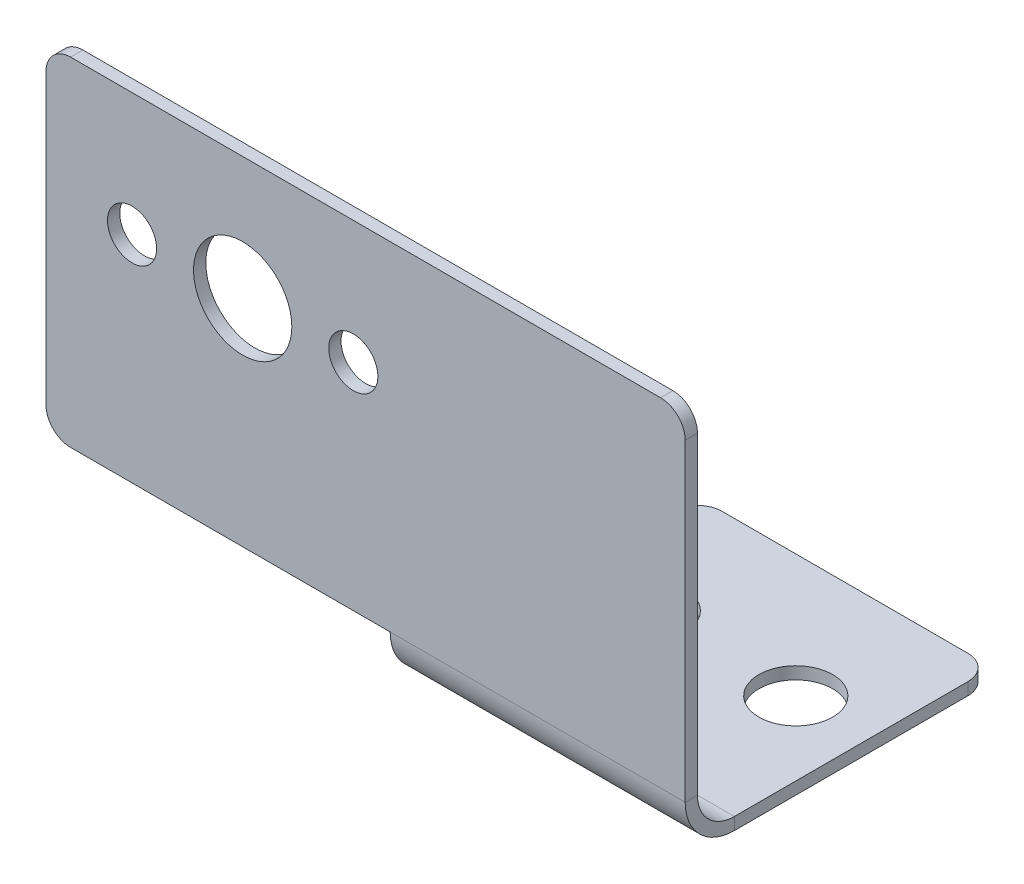
ISO-10303-21;
HEADER;
FILE_DESCRIPTION(('STEP AP214'),'2;1');
FILE_NAME('part.step','',(''),(''),'','','');
FILE_SCHEMA(('AUTOMOTIVE_DESIGN { 1 0 10303 214 1 1 1 1 }'));
ENDSEC;
DATA;
#1=APPLICATION_CONTEXT('core data for automotive mechanical design processes');
#2=APPLICATION_PROTOCOL_DEFINITION('international standard','automotive_design',2000,#1);
#3=PRODUCT_CONTEXT('',#1,'mechanical');
#4=PRODUCT('Part','Part','',(#3));
#5=PRODUCT_RELATED_PRODUCT_CATEGORY('part','',(#4));
#6=PRODUCT_DEFINITION_FORMATION('','',#4);
#7=PRODUCT_DEFINITION_CONTEXT('part definition',#1,'design');
#8=PRODUCT_DEFINITION('design','',#6,#7);
#9=PRODUCT_DEFINITION_SHAPE('','',#8);
#10=(LENGTH_UNIT() NAMED_UNIT(*) SI_UNIT(.MILLI.,.METRE.));
#11=(NAMED_UNIT(*) PLANE_ANGLE_UNIT() SI_UNIT($,.RADIAN.));
#12=(NAMED_UNIT(*) SI_UNIT($,.STERADIAN.) SOLID_ANGLE_UNIT());
#13=UNCERTAINTY_MEASURE_WITH_UNIT(LENGTH_MEASURE(1.E-05),#10,'distance_accuracy_value','');
#14=(GEOMETRIC_REPRESENTATION_CONTEXT(3) GLOBAL_UNCERTAINTY_ASSIGNED_CONTEXT((#13)) GLOBAL_UNIT_ASSIGNED_CONTEXT((#10,
#11,#12)) REPRESENTATION_CONTEXT('',''));
#15=CARTESIAN_POINT('',(0.,0.,0.));
#16=DIRECTION('',(0.,0.,1.));
#17=DIRECTION('',(1.,0.,0.));
#18=AXIS2_PLACEMENT_3D('',#15,#16,#17);
#19=CARTESIAN_POINT('',(6.,-11.7488935718911,-0.999999999999944));
#20=DIRECTION('',(1.,0.,0.));
#21=DIRECTION('',(0.,-1.,0.));
#22=AXIS2_PLACEMENT_3D('',#19,#20,#21);
#23=PLANE('',#22);
#24=DIRECTION('',(0.,-1.,0.));
#25=VECTOR('',#24,1.);
#26=CARTESIAN_POINT('',(6.,-11.7488935718911,-1.49999999999994));
#27=LINE('',#26,#25);
#28=CARTESIAN_POINT('',(6.,14.2511064281089,-1.50000000000004));
#29=VERTEX_POINT('',#28);
#30=CARTESIAN_POINT('',(6.,1.50000000000001,-1.49999999999999));
#31=VERTEX_POINT('',#30);
#32=EDGE_CURVE('E206',#29,#31,#27,.T.);
#33=ORIENTED_EDGE('',*,*,#32,.F.);
#34=DIRECTION('',(0.,0.,-1.));
#35=VECTOR('',#34,1.);
#36=CARTESIAN_POINT('',(6.,14.2511064281089,-1.00000000000004));
#37=LINE('',#36,#35);
#38=CARTESIAN_POINT('',(6.,14.2511064281089,-1.00000000000004));
#39=VERTEX_POINT('',#38);
#40=EDGE_CURVE('E12',#29,#39,#37,.F.);
#41=ORIENTED_EDGE('',*,*,#40,.T.);
#42=DIRECTION('',(0.,-1.,0.));
#43=VECTOR('',#42,1.);
#44=CARTESIAN_POINT('',(6.,-11.7488935718911,-0.999999999999944));
#45=LINE('',#44,#43);
#46=CARTESIAN_POINT('',(6.,1.50000000000001,-0.999999999999991));
#47=VERTEX_POINT('',#46);
#48=EDGE_CURVE('E231',#39,#47,#45,.T.);
#49=ORIENTED_EDGE('',*,*,#48,.T.);
#50=DIRECTION('',(0.,0.,-1.));
#51=VECTOR('',#50,1.);
#52=CARTESIAN_POINT('',(6.,1.50000000000001,-0.999999999999992));
#53=LINE('',#52,#51);
#54=EDGE_CURVE('E236',#47,#31,#53,.T.);
#55=ORIENTED_EDGE('',*,*,#54,.T.);
#56=EDGE_LOOP('',(#33,#41,#49,#55));
#57=FACE_BOUND('',#56,.T.);
#58=ADVANCED_FACE('F43',(#57),#23,.T.);
#59=CARTESIAN_POINT('',(0.,1.75110642810892,-1.49999999999999));
#60=DIRECTION('',(0.,0.,-1.));
#61=DIRECTION('',(0.,1.,0.));
#62=AXIS2_PLACEMENT_3D('',#59,#60,#61);
#63=PLANE('',#62);
#64=CARTESIAN_POINT('',(-16.5,10.2511064281089,-1.50000000000002));
#65=DIRECTION('',(0.,0.,-1.));
#66=DIRECTION('',(0.,1.,0.));
#67=AXIS2_PLACEMENT_3D('',#64,#65,#66);
#68=CIRCLE('',#67,1.);
#69=CARTESIAN_POINT('',(-16.5,11.2511064281089,-1.50000000000002));
#70=VERTEX_POINT('',#69);
#71=EDGE_CURVE('E195',#70,#70,#68,.T.);
#72=ORIENTED_EDGE('',*,*,#71,.F.);
#73=EDGE_LOOP('',(#72));
#74=FACE_BOUND('',#73,.T.);
#75=CARTESIAN_POINT('',(-7.5,10.2511064281089,-1.50000000000002));
#76=DIRECTION('',(0.,0.,-1.));
#77=DIRECTION('',(0.,1.,0.));
#78=AXIS2_PLACEMENT_3D('',#75,#76,#77);
#79=CIRCLE('',#78,1.);
#80=CARTESIAN_POINT('',(-7.5,11.2511064281089,-1.50000000000002));
#81=VERTEX_POINT('',#80);
#82=EDGE_CURVE('E412',#81,#81,#79,.T.);
#83=ORIENTED_EDGE('',*,*,#82,.F.);
#84=EDGE_LOOP('',(#83));
#85=FACE_BOUND('',#84,.T.);
#86=CARTESIAN_POINT('',(-12.,10.2511064281089,-1.50000000000002));
#87=DIRECTION('',(0.,0.,-1.));
#88=DIRECTION('',(0.,1.,0.));
#89=AXIS2_PLACEMENT_3D('',#86,#87,#88);
#90=CIRCLE('',#89,2.);
#91=CARTESIAN_POINT('',(-12.,12.2511064281089,-1.50000000000003));
#92=VERTEX_POINT('',#91);
#93=EDGE_CURVE('E405',#92,#92,#90,.T.);
#94=ORIENTED_EDGE('',*,*,#93,.F.);
#95=EDGE_LOOP('',(#94));
#96=FACE_BOUND('',#95,.T.);
#97=DIRECTION('',(-1.,0.,0.));
#98=VECTOR('',#97,1.);
#99=CARTESIAN_POINT('',(-20.,1.50000000000001,-1.49999999999999));
#100=LINE('',#99,#98);
#101=CARTESIAN_POINT('',(-6.,1.50000000000001,-1.49999999999999));
#102=VERTEX_POINT('',#101);
#103=CARTESIAN_POINT('',(-19.,1.50000000000001,-1.49999999999999));
#104=VERTEX_POINT('',#103);
#105=EDGE_CURVE('E179',#102,#104,#100,.T.);
#106=ORIENTED_EDGE('',*,*,#105,.T.);
#107=CARTESIAN_POINT('',(-19.,2.50000000000001,-1.49999999999999));
#108=DIRECTION('',(0.,0.,-1.));
#109=DIRECTION('',(0.,1.,0.));
#110=AXIS2_PLACEMENT_3D('',#107,#108,#109);
#111=CIRCLE('',#110,1.);
#112=CARTESIAN_POINT('',(-20.,2.50000000000001,-1.49999999999999));
#113=VERTEX_POINT('',#112);
#114=EDGE_CURVE('E247',#104,#113,#111,.T.);
#115=ORIENTED_EDGE('',*,*,#114,.T.);
#116=DIRECTION('',(0.,1.,0.));
#117=VECTOR('',#116,1.);
#118=CARTESIAN_POINT('',(-20.,15.2511064281089,-1.50000000000004));
#119=LINE('',#118,#117);
#120=CARTESIAN_POINT('',(-20.,14.2511064281089,-1.50000000000004));
#121=VERTEX_POINT('',#120);
#122=EDGE_CURVE('E187',#113,#121,#119,.T.);
#123=ORIENTED_EDGE('',*,*,#122,.T.);
#124=CARTESIAN_POINT('',(-19.,14.2511064281089,-1.50000000000004));
#125=DIRECTION('',(0.,0.,-1.));
#126=DIRECTION('',(0.,1.,0.));
#127=AXIS2_PLACEMENT_3D('',#124,#125,#126);
#128=CIRCLE('',#127,1.);
#129=CARTESIAN_POINT('',(-19.,15.2511064281089,-1.50000000000004));
#130=VERTEX_POINT('',#129);
#131=EDGE_CURVE('E245',#121,#130,#128,.T.);
#132=ORIENTED_EDGE('',*,*,#131,.T.);
#133=DIRECTION('',(1.,0.,0.));
#134=VECTOR('',#133,1.);
#135=CARTESIAN_POINT('',(-6.,15.2511064281089,-1.50000000000004));
#136=LINE('',#135,#134);
#137=CARTESIAN_POINT('',(5.,15.2511064281089,-1.50000000000004));
#138=VERTEX_POINT('',#137);
#139=EDGE_CURVE('E232',#130,#138,#136,.T.);
#140=ORIENTED_EDGE('',*,*,#139,.T.);
#141=CARTESIAN_POINT('',(5.,14.2511064281089,-1.50000000000004));
#142=DIRECTION('',(0.,0.,-1.));
#143=DIRECTION('',(0.,1.,0.));
#144=AXIS2_PLACEMENT_3D('',#141,#142,#143);
#145=CIRCLE('',#144,1.);
#146=EDGE_CURVE('E243',#138,#29,#145,.T.);
#147=ORIENTED_EDGE('',*,*,#146,.T.);
#148=ORIENTED_EDGE('',*,*,#32,.T.);
#149=DIRECTION('',(-1.,0.,0.));
#150=VECTOR('',#149,1.);
#151=CARTESIAN_POINT('',(0.,1.50000000000001,-1.49999999999999));
#152=LINE('',#151,#150);
#153=EDGE_CURVE('E180',#31,#102,#152,.T.);
#154=ORIENTED_EDGE('',*,*,#153,.T.);
#155=EDGE_LOOP('',(#106,#115,#123,#132,#140,#147,#148,#154));
#156=FACE_BOUND('',#155,.T.);
#157=ADVANCED_FACE('F293',(#74,#85,#96,#156),#63,.T.);
#158=CARTESIAN_POINT('',(-6.,15.2511064281089,-1.00000000000004));
#159=DIRECTION('',(0.,1.,0.));
#160=DIRECTION('',(1.,0.,0.));
#161=AXIS2_PLACEMENT_3D('',#158,#159,#160);
#162=PLANE('',#161);
#163=ORIENTED_EDGE('',*,*,#139,.F.);
#164=DIRECTION('',(0.,0.,-1.));
#165=VECTOR('',#164,1.);
#166=CARTESIAN_POINT('',(-19.,15.2511064281089,-1.00000000000004));
#167=LINE('',#166,#165);
#168=CARTESIAN_POINT('',(-19.,15.2511064281089,-1.00000000000004));
#169=VERTEX_POINT('',#168);
#170=EDGE_CURVE('E262',#130,#169,#167,.F.);
#171=ORIENTED_EDGE('',*,*,#170,.T.);
#172=DIRECTION('',(1.,0.,0.));
#173=VECTOR('',#172,1.);
#174=CARTESIAN_POINT('',(-6.,15.2511064281089,-1.00000000000004));
#175=LINE('',#174,#173);
#176=CARTESIAN_POINT('',(5.,15.2511064281089,-1.00000000000004));
#177=VERTEX_POINT('',#176);
#178=EDGE_CURVE('E169',#169,#177,#175,.T.);
#179=ORIENTED_EDGE('',*,*,#178,.T.);
#180=DIRECTION('',(0.,0.,-1.));
#181=VECTOR('',#180,1.);
#182=CARTESIAN_POINT('',(5.,15.2511064281089,-1.00000000000004));
#183=LINE('',#182,#181);
#184=EDGE_CURVE('E259',#177,#138,#183,.T.);
#185=ORIENTED_EDGE('',*,*,#184,.T.);
#186=EDGE_LOOP('',(#163,#171,#179,#185));
#187=FACE_BOUND('',#186,.T.);
#188=ADVANCED_FACE('F303',(#187),#162,.T.);
#189=CARTESIAN_POINT('',(0.,1.75110642810892,-0.999999999999992));
#190=DIRECTION('',(0.,0.,-1.));
#191=DIRECTION('',(0.,1.,0.));
#192=AXIS2_PLACEMENT_3D('',#189,#190,#191);
#193=PLANE('',#192);
#194=CARTESIAN_POINT('',(-16.5,10.2511064281089,-0.999999999999986));
#195=DIRECTION('',(0.,0.,1.));
#196=DIRECTION('',(1.,0.,0.));
#197=AXIS2_PLACEMENT_3D('',#194,#195,#196);
#198=CIRCLE('',#197,1.);
#199=CARTESIAN_POINT('',(-15.5,10.2511064281089,-0.999999999999986));
#200=VERTEX_POINT('',#199);
#201=EDGE_CURVE('E402',#200,#200,#198,.T.);
#202=ORIENTED_EDGE('',*,*,#201,.F.);
#203=EDGE_LOOP('',(#202));
#204=FACE_BOUND('',#203,.T.);
#205=CARTESIAN_POINT('',(-7.5,10.2511064281089,-0.999999999999986));
#206=DIRECTION('',(0.,0.,1.));
#207=DIRECTION('',(1.,0.,0.));
#208=AXIS2_PLACEMENT_3D('',#205,#206,#207);
#209=CIRCLE('',#208,1.);
#210=CARTESIAN_POINT('',(-6.5,10.2511064281089,-0.999999999999986));
#211=VERTEX_POINT('',#210);
#212=EDGE_CURVE('E406',#211,#211,#209,.T.);
#213=ORIENTED_EDGE('',*,*,#212,.F.);
#214=EDGE_LOOP('',(#213));
#215=FACE_BOUND('',#214,.T.);
#216=CARTESIAN_POINT('',(-12.,10.2511064281089,-0.999999999999986));
#217=DIRECTION('',(0.,0.,1.));
#218=DIRECTION('',(1.,0.,0.));
#219=AXIS2_PLACEMENT_3D('',#216,#217,#218);
#220=CIRCLE('',#219,2.);
#221=CARTESIAN_POINT('',(-10.,10.2511064281089,-0.999999999999986));
#222=VERTEX_POINT('',#221);
#223=EDGE_CURVE('E396',#222,#222,#220,.T.);
#224=ORIENTED_EDGE('',*,*,#223,.F.);
#225=EDGE_LOOP('',(#224));
#226=FACE_BOUND('',#225,.T.);
#227=DIRECTION('',(0.,1.,0.));
#228=VECTOR('',#227,1.);
#229=CARTESIAN_POINT('',(-20.,15.2511064281089,-1.00000000000004));
#230=LINE('',#229,#228);
#231=CARTESIAN_POINT('',(-20.,2.50000000000001,-0.999999999999994));
#232=VERTEX_POINT('',#231);
#233=CARTESIAN_POINT('',(-20.,14.2511064281089,-1.00000000000004));
#234=VERTEX_POINT('',#233);
#235=EDGE_CURVE('E186',#232,#234,#230,.T.);
#236=ORIENTED_EDGE('',*,*,#235,.F.);
#237=CARTESIAN_POINT('',(-19.,2.50000000000001,-0.999999999999994));
#238=DIRECTION('',(0.,0.,-1.));
#239=DIRECTION('',(0.,1.,0.));
#240=AXIS2_PLACEMENT_3D('',#237,#238,#239);
#241=CIRCLE('',#240,1.);
#242=CARTESIAN_POINT('',(-19.,1.50000000000001,-0.999999999999991));
#243=VERTEX_POINT('',#242);
#244=EDGE_CURVE('E185',#232,#243,#241,.F.);
#245=ORIENTED_EDGE('',*,*,#244,.T.);
#246=DIRECTION('',(-1.,0.,0.));
#247=VECTOR('',#246,1.);
#248=CARTESIAN_POINT('',(-20.,1.50000000000001,-0.999999999999991));
#249=LINE('',#248,#247);
#250=CARTESIAN_POINT('',(-6.,1.50000000000001,-0.999999999999991));
#251=VERTEX_POINT('',#250);
#252=EDGE_CURVE('E176',#251,#243,#249,.T.);
#253=ORIENTED_EDGE('',*,*,#252,.F.);
#254=DIRECTION('',(-1.,0.,0.));
#255=VECTOR('',#254,1.);
#256=CARTESIAN_POINT('',(0.,1.50000000000001,-0.999999999999991));
#257=LINE('',#256,#255);
#258=EDGE_CURVE('E162',#47,#251,#257,.T.);
#259=ORIENTED_EDGE('',*,*,#258,.F.);
#260=ORIENTED_EDGE('',*,*,#48,.F.);
#261=CARTESIAN_POINT('',(5.,14.2511064281089,-1.00000000000004));
#262=DIRECTION('',(0.,0.,-1.));
#263=DIRECTION('',(0.,1.,0.));
#264=AXIS2_PLACEMENT_3D('',#261,#262,#263);
#265=CIRCLE('',#264,1.);
#266=EDGE_CURVE('E254',#39,#177,#265,.F.);
#267=ORIENTED_EDGE('',*,*,#266,.T.);
#268=ORIENTED_EDGE('',*,*,#178,.F.);
#269=CARTESIAN_POINT('',(-19.,14.2511064281089,-1.00000000000004));
#270=DIRECTION('',(0.,0.,-1.));
#271=DIRECTION('',(0.,1.,0.));
#272=AXIS2_PLACEMENT_3D('',#269,#270,#271);
#273=CIRCLE('',#272,1.);
#274=EDGE_CURVE('E256',#169,#234,#273,.F.);
#275=ORIENTED_EDGE('',*,*,#274,.T.);
#276=EDGE_LOOP('',(#236,#245,#253,#259,#260,#267,#268,#275));
#277=FACE_BOUND('',#276,.T.);
#278=ADVANCED_FACE('F183',(#204,#215,#226,#277),#193,.F.);
#279=CARTESIAN_POINT('',(-6.,-0.5,-13.5));
#280=DIRECTION('',(0.,0.,-1.));
#281=DIRECTION('',(-1.,0.,0.));
#282=AXIS2_PLACEMENT_3D('',#279,#280,#281);
#283=PLANE('',#282);
#284=DIRECTION('',(-1.,0.,0.));
#285=VECTOR('',#284,1.);
#286=CARTESIAN_POINT('',(-6.,-0.5,-13.5));
#287=LINE('',#286,#285);
#288=CARTESIAN_POINT('',(5.,-0.5,-13.5));
#289=VERTEX_POINT('',#288);
#290=CARTESIAN_POINT('',(-5.,-0.5,-13.5));
#291=VERTEX_POINT('',#290);
#292=EDGE_CURVE('E220',#289,#291,#287,.T.);
#293=ORIENTED_EDGE('',*,*,#292,.T.);
#294=DIRECTION('',(0.,1.,0.));
#295=VECTOR('',#294,1.);
#296=CARTESIAN_POINT('',(-5.,-0.5,-13.5));
#297=LINE('',#296,#295);
#298=CARTESIAN_POINT('',(-5.,0.,-13.5));
#299=VERTEX_POINT('',#298);
#300=EDGE_CURVE('E266',#291,#299,#297,.T.);
#301=ORIENTED_EDGE('',*,*,#300,.T.);
#302=DIRECTION('',(-1.,0.,0.));
#303=VECTOR('',#302,1.);
#304=CARTESIAN_POINT('',(-6.,0.,-13.5));
#305=LINE('',#304,#303);
#306=CARTESIAN_POINT('',(5.,0.,-13.5));
#307=VERTEX_POINT('',#306);
#308=EDGE_CURVE('E209',#307,#299,#305,.T.);
#309=ORIENTED_EDGE('',*,*,#308,.F.);
#310=DIRECTION('',(0.,1.,0.));
#311=VECTOR('',#310,1.);
#312=CARTESIAN_POINT('',(5.,-0.5,-13.5));
#313=LINE('',#312,#311);
#314=EDGE_CURVE('E264',#307,#289,#313,.F.);
#315=ORIENTED_EDGE('',*,*,#314,.T.);
#316=EDGE_LOOP('',(#293,#301,#309,#315));
#317=FACE_BOUND('',#316,.T.);
#318=ADVANCED_FACE('F337',(#317),#283,.T.);
#319=CARTESIAN_POINT('',(0.,-0.5,0.));
#320=DIRECTION('',(0.,1.,0.));
#321=DIRECTION('',(0.,0.,1.));
#322=AXIS2_PLACEMENT_3D('',#319,#320,#321);
#323=PLANE('',#322);
#324=CARTESIAN_POINT('',(-3.,-0.5,-8.5));
#325=DIRECTION('',(0.,1.,0.));
#326=DIRECTION('',(0.,0.,1.));
#327=AXIS2_PLACEMENT_3D('',#324,#325,#326);
#328=CIRCLE('',#327,1.5);
#329=CARTESIAN_POINT('',(-3.,-0.5,-7.));
#330=VERTEX_POINT('',#329);
#331=EDGE_CURVE('E392',#330,#330,#328,.T.);
#332=ORIENTED_EDGE('',*,*,#331,.T.);
#333=EDGE_LOOP('',(#332));
#334=FACE_BOUND('',#333,.T.);
#335=CARTESIAN_POINT('',(3.,-0.5,-8.5));
#336=DIRECTION('',(0.,1.,0.));
#337=DIRECTION('',(0.,0.,1.));
#338=AXIS2_PLACEMENT_3D('',#335,#336,#337);
#339=CIRCLE('',#338,1.5);
#340=CARTESIAN_POINT('',(3.,-0.5,-7.));
#341=VERTEX_POINT('',#340);
#342=EDGE_CURVE('E390',#341,#341,#339,.T.);
#343=ORIENTED_EDGE('',*,*,#342,.T.);
#344=EDGE_LOOP('',(#343));
#345=FACE_BOUND('',#344,.T.);
#346=DIRECTION('',(0.,0.,1.));
#347=VECTOR('',#346,1.);
#348=CARTESIAN_POINT('',(-6.,-0.5,-13.5));
#349=LINE('',#348,#347);
#350=CARTESIAN_POINT('',(-6.,-0.5,-12.5));
#351=VERTEX_POINT('',#350);
#352=CARTESIAN_POINT('',(-6.,-0.5,-2.99999999999999));
#353=VERTEX_POINT('',#352);
#354=EDGE_CURVE('E215',#351,#353,#349,.T.);
#355=ORIENTED_EDGE('',*,*,#354,.F.);
#356=CARTESIAN_POINT('',(-5.,-0.5,-12.5));
#357=DIRECTION('',(0.,1.,0.));
#358=DIRECTION('',(0.,0.,1.));
#359=AXIS2_PLACEMENT_3D('',#356,#357,#358);
#360=CIRCLE('',#359,1.);
#361=EDGE_CURVE('E275',#351,#291,#360,.F.);
#362=ORIENTED_EDGE('',*,*,#361,.T.);
#363=ORIENTED_EDGE('',*,*,#292,.F.);
#364=CARTESIAN_POINT('',(5.,-0.5,-12.5));
#365=DIRECTION('',(0.,1.,0.));
#366=DIRECTION('',(0.,0.,1.));
#367=AXIS2_PLACEMENT_3D('',#364,#365,#366);
#368=CIRCLE('',#367,1.);
#369=CARTESIAN_POINT('',(6.,-0.5,-12.5));
#370=VERTEX_POINT('',#369);
#371=EDGE_CURVE('E58',#289,#370,#368,.F.);
#372=ORIENTED_EDGE('',*,*,#371,.T.);
#373=DIRECTION('',(0.,0.,-1.));
#374=VECTOR('',#373,1.);
#375=CARTESIAN_POINT('',(6.,-0.5,-13.5));
#376=LINE('',#375,#374);
#377=CARTESIAN_POINT('',(6.,-0.5,-2.99999999999999));
#378=VERTEX_POINT('',#377);
#379=EDGE_CURVE('E204',#378,#370,#376,.T.);
#380=ORIENTED_EDGE('',*,*,#379,.F.);
#381=DIRECTION('',(-1.,0.,0.));
#382=VECTOR('',#381,1.);
#383=CARTESIAN_POINT('',(0.,-0.5,-2.99999999999999));
#384=LINE('',#383,#382);
#385=EDGE_CURVE('E217',#378,#353,#384,.T.);
#386=ORIENTED_EDGE('',*,*,#385,.T.);
#387=EDGE_LOOP('',(#355,#362,#363,#372,#380,#386));
#388=FACE_BOUND('',#387,.T.);
#389=ADVANCED_FACE('F349',(#334,#345,#388),#323,.F.);
#390=CARTESIAN_POINT('',(-6.,-0.5,-13.5));
#391=DIRECTION('',(-1.,0.,0.));
#392=DIRECTION('',(0.,0.,1.));
#393=AXIS2_PLACEMENT_3D('',#390,#391,#392);
#394=PLANE('',#393);
#395=DIRECTION('',(0.,0.,1.));
#396=VECTOR('',#395,1.);
#397=CARTESIAN_POINT('',(-6.,0.,-13.5));
#398=LINE('',#397,#396);
#399=CARTESIAN_POINT('',(-6.,0.,-12.5));
#400=VERTEX_POINT('',#399);
#401=CARTESIAN_POINT('',(-6.,0.,-2.99999999999999));
#402=VERTEX_POINT('',#401);
#403=EDGE_CURVE('E207',#400,#402,#398,.T.);
#404=ORIENTED_EDGE('',*,*,#403,.F.);
#405=DIRECTION('',(0.,1.,0.));
#406=VECTOR('',#405,1.);
#407=CARTESIAN_POINT('',(-6.,-0.5,-12.5));
#408=LINE('',#407,#406);
#409=EDGE_CURVE('E66',#400,#351,#408,.F.);
#410=ORIENTED_EDGE('',*,*,#409,.T.);
#411=ORIENTED_EDGE('',*,*,#354,.T.);
#412=DIRECTION('',(0.,-1.,0.));
#413=VECTOR('',#412,1.);
#414=CARTESIAN_POINT('',(-6.,-0.499999999999999,-2.99999999999999));
#415=LINE('',#414,#413);
#416=EDGE_CURVE('E154',#402,#353,#415,.T.);
#417=ORIENTED_EDGE('',*,*,#416,.F.);
#418=EDGE_LOOP('',(#404,#410,#411,#417));
#419=FACE_BOUND('',#418,.T.);
#420=ADVANCED_FACE('F345',(#419),#394,.T.);
#421=CARTESIAN_POINT('',(0.,0.,0.));
#422=DIRECTION('',(0.,1.,0.));
#423=DIRECTION('',(0.,0.,1.));
#424=AXIS2_PLACEMENT_3D('',#421,#422,#423);
#425=PLANE('',#424);
#426=CARTESIAN_POINT('',(-3.,0.,-8.5));
#427=DIRECTION('',(0.,1.,0.));
#428=DIRECTION('',(0.,0.,1.));
#429=AXIS2_PLACEMENT_3D('',#426,#427,#428);
#430=CIRCLE('',#429,1.5);
#431=CARTESIAN_POINT('',(-3.,0.,-7.));
#432=VERTEX_POINT('',#431);
#433=EDGE_CURVE('E393',#432,#432,#430,.T.);
#434=ORIENTED_EDGE('',*,*,#433,.F.);
#435=EDGE_LOOP('',(#434));
#436=FACE_BOUND('',#435,.T.);
#437=CARTESIAN_POINT('',(3.,0.,-8.5));
#438=DIRECTION('',(0.,1.,0.));
#439=DIRECTION('',(0.,0.,1.));
#440=AXIS2_PLACEMENT_3D('',#437,#438,#439);
#441=CIRCLE('',#440,1.5);
#442=CARTESIAN_POINT('',(3.,0.,-7.));
#443=VERTEX_POINT('',#442);
#444=EDGE_CURVE('E387',#443,#443,#441,.T.);
#445=ORIENTED_EDGE('',*,*,#444,.F.);
#446=EDGE_LOOP('',(#445));
#447=FACE_BOUND('',#446,.T.);
#448=ORIENTED_EDGE('',*,*,#308,.T.);
#449=CARTESIAN_POINT('',(-5.,0.,-12.5));
#450=DIRECTION('',(0.,1.,0.));
#451=DIRECTION('',(0.,0.,1.));
#452=AXIS2_PLACEMENT_3D('',#449,#450,#451);
#453=CIRCLE('',#452,1.);
#454=EDGE_CURVE('E271',#299,#400,#453,.T.);
#455=ORIENTED_EDGE('',*,*,#454,.T.);
#456=ORIENTED_EDGE('',*,*,#403,.T.);
#457=DIRECTION('',(-1.,0.,0.));
#458=VECTOR('',#457,1.);
#459=CARTESIAN_POINT('',(0.,0.,-2.99999999999999));
#460=LINE('',#459,#458);
#461=CARTESIAN_POINT('',(6.,0.,-2.99999999999999));
#462=VERTEX_POINT('',#461);
#463=EDGE_CURVE('E224',#462,#402,#460,.T.);
#464=ORIENTED_EDGE('',*,*,#463,.F.);
#465=DIRECTION('',(0.,0.,-1.));
#466=VECTOR('',#465,1.);
#467=CARTESIAN_POINT('',(6.,0.,-13.5));
#468=LINE('',#467,#466);
#469=CARTESIAN_POINT('',(6.,0.,-12.5));
#470=VERTEX_POINT('',#469);
#471=EDGE_CURVE('E212',#462,#470,#468,.T.);
#472=ORIENTED_EDGE('',*,*,#471,.T.);
#473=CARTESIAN_POINT('',(5.,0.,-12.5));
#474=DIRECTION('',(0.,1.,0.));
#475=DIRECTION('',(0.,0.,1.));
#476=AXIS2_PLACEMENT_3D('',#473,#474,#475);
#477=CIRCLE('',#476,1.);
#478=EDGE_CURVE('E269',#470,#307,#477,.T.);
#479=ORIENTED_EDGE('',*,*,#478,.T.);
#480=EDGE_LOOP('',(#448,#455,#456,#464,#472,#479));
#481=FACE_BOUND('',#480,.T.);
#482=ADVANCED_FACE('F284',(#436,#447,#481),#425,.T.);
#483=CARTESIAN_POINT('',(6.,-0.5,-13.5));
#484=DIRECTION('',(1.,0.,0.));
#485=DIRECTION('',(0.,0.,-1.));
#486=AXIS2_PLACEMENT_3D('',#483,#484,#485);
#487=PLANE('',#486);
#488=ORIENTED_EDGE('',*,*,#379,.T.);
#489=DIRECTION('',(0.,1.,0.));
#490=VECTOR('',#489,1.);
#491=CARTESIAN_POINT('',(6.,-0.5,-12.5));
#492=LINE('',#491,#490);
#493=EDGE_CURVE('E51',#370,#470,#492,.T.);
#494=ORIENTED_EDGE('',*,*,#493,.T.);
#495=ORIENTED_EDGE('',*,*,#471,.F.);
#496=DIRECTION('',(0.,1.,0.));
#497=VECTOR('',#496,1.);
#498=CARTESIAN_POINT('',(6.,-0.499999999999999,-2.99999999999999));
#499=LINE('',#498,#497);
#500=EDGE_CURVE('E157',#378,#462,#499,.T.);
#501=ORIENTED_EDGE('',*,*,#500,.F.);
#502=EDGE_LOOP('',(#488,#494,#495,#501));
#503=FACE_BOUND('',#502,.T.);
#504=ADVANCED_FACE('F279',(#503),#487,.T.);
#505=CARTESIAN_POINT('',(6.,1.5,-2.99999999999999));
#506=DIRECTION('',(1.,0.,0.));
#507=DIRECTION('',(0.,0.,-1.));
#508=AXIS2_PLACEMENT_3D('',#505,#506,#507);
#509=PLANE('',#508);
#510=ORIENTED_EDGE('',*,*,#500,.T.);
#511=CARTESIAN_POINT('',(6.,1.5,-2.99999999999999));
#512=DIRECTION('',(-1.,0.,0.));
#513=DIRECTION('',(0.,0.,1.));
#514=AXIS2_PLACEMENT_3D('',#511,#512,#513);
#515=CIRCLE('',#514,1.5);
#516=EDGE_CURVE('E190',#462,#31,#515,.T.);
#517=ORIENTED_EDGE('',*,*,#516,.T.);
#518=ORIENTED_EDGE('',*,*,#54,.F.);
#519=CARTESIAN_POINT('',(6.,1.5,-2.99999999999999));
#520=DIRECTION('',(-1.,0.,0.));
#521=DIRECTION('',(0.,0.,-1.));
#522=AXIS2_PLACEMENT_3D('',#519,#520,#521);
#523=CIRCLE('',#522,2.);
#524=EDGE_CURVE('E158',#378,#47,#523,.T.);
#525=ORIENTED_EDGE('',*,*,#524,.F.);
#526=EDGE_LOOP('',(#510,#517,#518,#525));
#527=FACE_BOUND('',#526,.T.);
#528=ADVANCED_FACE('F289',(#527),#509,.T.);
#529=CARTESIAN_POINT('',(-6.,1.5,-2.99999999999999));
#530=DIRECTION('',(-1.,0.,0.));
#531=DIRECTION('',(0.,0.,1.));
#532=AXIS2_PLACEMENT_3D('',#529,#530,#531);
#533=PLANE('',#532);
#534=DIRECTION('',(0.,0.,1.));
#535=VECTOR('',#534,1.);
#536=CARTESIAN_POINT('',(-6.,1.50000000000001,-0.999999999999992));
#537=LINE('',#536,#535);
#538=EDGE_CURVE('E151',#102,#251,#537,.T.);
#539=ORIENTED_EDGE('',*,*,#538,.F.);
#540=CARTESIAN_POINT('',(-6.,1.5,-2.99999999999999));
#541=DIRECTION('',(-1.,0.,0.));
#542=DIRECTION('',(0.,0.,1.));
#543=AXIS2_PLACEMENT_3D('',#540,#541,#542);
#544=CIRCLE('',#543,1.5);
#545=EDGE_CURVE('E199',#102,#402,#544,.F.);
#546=ORIENTED_EDGE('',*,*,#545,.T.);
#547=ORIENTED_EDGE('',*,*,#416,.T.);
#548=CARTESIAN_POINT('',(-6.,1.5,-2.99999999999999));
#549=DIRECTION('',(1.,0.,0.));
#550=DIRECTION('',(0.,0.,1.));
#551=AXIS2_PLACEMENT_3D('',#548,#549,#550);
#552=CIRCLE('',#551,2.);
#553=EDGE_CURVE('E146',#251,#353,#552,.T.);
#554=ORIENTED_EDGE('',*,*,#553,.F.);
#555=EDGE_LOOP('',(#539,#546,#547,#554));
#556=FACE_BOUND('',#555,.T.);
#557=ADVANCED_FACE('F148',(#556),#533,.T.);
#558=CARTESIAN_POINT('',(12.3209746314804,1.5,-2.99999999999999));
#559=DIRECTION('',(-1.,0.,0.));
#560=DIRECTION('',(0.,0.,1.));
#561=AXIS2_PLACEMENT_3D('',#558,#559,#560);
#562=CYLINDRICAL_SURFACE('',#561,2.);
#563=ORIENTED_EDGE('',*,*,#553,.T.);
#564=ORIENTED_EDGE('',*,*,#385,.F.);
#565=ORIENTED_EDGE('',*,*,#524,.T.);
#566=ORIENTED_EDGE('',*,*,#258,.T.);
#567=EDGE_LOOP('',(#563,#564,#565,#566));
#568=FACE_BOUND('',#567,.T.);
#569=ADVANCED_FACE('F163',(#568),#562,.T.);
#570=CARTESIAN_POINT('',(12.3209746314804,1.5,-2.99999999999999));
#571=DIRECTION('',(-1.,0.,0.));
#572=DIRECTION('',(0.,0.,1.));
#573=AXIS2_PLACEMENT_3D('',#570,#571,#572);
#574=CYLINDRICAL_SURFACE('',#573,1.5);
#575=ORIENTED_EDGE('',*,*,#545,.F.);
#576=ORIENTED_EDGE('',*,*,#153,.F.);
#577=ORIENTED_EDGE('',*,*,#516,.F.);
#578=ORIENTED_EDGE('',*,*,#463,.T.);
#579=EDGE_LOOP('',(#575,#576,#577,#578));
#580=FACE_BOUND('',#579,.T.);
#581=ADVANCED_FACE('F291',(#580),#574,.F.);
#582=CARTESIAN_POINT('',(-20.,15.2511064281089,-1.00000000000004));
#583=DIRECTION('',(-1.,0.,0.));
#584=DIRECTION('',(0.,-1.,0.));
#585=AXIS2_PLACEMENT_3D('',#582,#583,#584);
#586=PLANE('',#585);
#587=ORIENTED_EDGE('',*,*,#122,.F.);
#588=DIRECTION('',(0.,0.,-1.));
#589=VECTOR('',#588,1.);
#590=CARTESIAN_POINT('',(-20.,2.50000000000001,-0.999999999999995));
#591=LINE('',#590,#589);
#592=EDGE_CURVE('E252',#113,#232,#591,.F.);
#593=ORIENTED_EDGE('',*,*,#592,.T.);
#594=ORIENTED_EDGE('',*,*,#235,.T.);
#595=DIRECTION('',(0.,0.,-1.));
#596=VECTOR('',#595,1.);
#597=CARTESIAN_POINT('',(-20.,14.2511064281089,-1.00000000000004));
#598=LINE('',#597,#596);
#599=EDGE_CURVE('E249',#234,#121,#598,.T.);
#600=ORIENTED_EDGE('',*,*,#599,.T.);
#601=EDGE_LOOP('',(#587,#593,#594,#600));
#602=FACE_BOUND('',#601,.T.);
#603=ADVANCED_FACE('F311',(#602),#586,.T.);
#604=CARTESIAN_POINT('',(-20.,1.50000000000001,-0.999999999999991));
#605=DIRECTION('',(0.,-1.,0.));
#606=DIRECTION('',(0.,0.,-1.));
#607=AXIS2_PLACEMENT_3D('',#604,#605,#606);
#608=PLANE('',#607);
#609=ORIENTED_EDGE('',*,*,#252,.T.);
#610=DIRECTION('',(0.,0.,-1.));
#611=VECTOR('',#610,1.);
#612=CARTESIAN_POINT('',(-19.,1.50000000000001,-0.999999999999991));
#613=LINE('',#612,#611);
#614=EDGE_CURVE('E239',#243,#104,#613,.T.);
#615=ORIENTED_EDGE('',*,*,#614,.T.);
#616=ORIENTED_EDGE('',*,*,#105,.F.);
#617=ORIENTED_EDGE('',*,*,#538,.T.);
#618=EDGE_LOOP('',(#609,#615,#616,#617));
#619=FACE_BOUND('',#618,.T.);
#620=ADVANCED_FACE('F174',(#619),#608,.T.);
#621=CARTESIAN_POINT('',(-12.,10.2511064281089,-11.));
#622=DIRECTION('',(0.,0.,1.));
#623=DIRECTION('',(1.,0.,0.));
#624=AXIS2_PLACEMENT_3D('',#621,#622,#623);
#625=CYLINDRICAL_SURFACE('',#624,2.);
#626=ORIENTED_EDGE('',*,*,#93,.T.);
#627=EDGE_LOOP('',(#626));
#628=FACE_BOUND('',#627,.T.);
#629=ORIENTED_EDGE('',*,*,#223,.T.);
#630=EDGE_LOOP('',(#629));
#631=FACE_BOUND('',#630,.T.);
#632=ADVANCED_FACE('F366',(#628,#631),#625,.F.);
#633=CARTESIAN_POINT('',(-7.5,10.2511064281089,-11.));
#634=DIRECTION('',(0.,0.,1.));
#635=DIRECTION('',(1.,0.,0.));
#636=AXIS2_PLACEMENT_3D('',#633,#634,#635);
#637=CYLINDRICAL_SURFACE('',#636,1.);
#638=ORIENTED_EDGE('',*,*,#82,.T.);
#639=EDGE_LOOP('',(#638));
#640=FACE_BOUND('',#639,.T.);
#641=ORIENTED_EDGE('',*,*,#212,.T.);
#642=EDGE_LOOP('',(#641));
#643=FACE_BOUND('',#642,.T.);
#644=ADVANCED_FACE('F371',(#640,#643),#637,.F.);
#645=CARTESIAN_POINT('',(-16.5,10.2511064281089,-11.));
#646=DIRECTION('',(0.,0.,1.));
#647=DIRECTION('',(1.,0.,0.));
#648=AXIS2_PLACEMENT_3D('',#645,#646,#647);
#649=CYLINDRICAL_SURFACE('',#648,1.);
#650=ORIENTED_EDGE('',*,*,#71,.T.);
#651=EDGE_LOOP('',(#650));
#652=FACE_BOUND('',#651,.T.);
#653=ORIENTED_EDGE('',*,*,#201,.T.);
#654=EDGE_LOOP('',(#653));
#655=FACE_BOUND('',#654,.T.);
#656=ADVANCED_FACE('F375',(#652,#655),#649,.F.);
#657=CARTESIAN_POINT('',(3.,-10.,-8.5));
#658=DIRECTION('',(0.,1.,0.));
#659=DIRECTION('',(0.,0.,1.));
#660=AXIS2_PLACEMENT_3D('',#657,#658,#659);
#661=CYLINDRICAL_SURFACE('',#660,1.5);
#662=ORIENTED_EDGE('',*,*,#444,.T.);
#663=EDGE_LOOP('',(#662));
#664=FACE_BOUND('',#663,.T.);
#665=ORIENTED_EDGE('',*,*,#342,.F.);
#666=EDGE_LOOP('',(#665));
#667=FACE_BOUND('',#666,.T.);
#668=ADVANCED_FACE('F324',(#664,#667),#661,.F.);
#669=CARTESIAN_POINT('',(-3.,-10.,-8.5));
#670=DIRECTION('',(0.,1.,0.));
#671=DIRECTION('',(0.,0.,1.));
#672=AXIS2_PLACEMENT_3D('',#669,#670,#671);
#673=CYLINDRICAL_SURFACE('',#672,1.5);
#674=ORIENTED_EDGE('',*,*,#433,.T.);
#675=EDGE_LOOP('',(#674));
#676=FACE_BOUND('',#675,.T.);
#677=ORIENTED_EDGE('',*,*,#331,.F.);
#678=EDGE_LOOP('',(#677));
#679=FACE_BOUND('',#678,.T.);
#680=ADVANCED_FACE('F316',(#676,#679),#673,.F.);
#681=CARTESIAN_POINT('',(-19.,2.50000000000001,-0.999999999999994));
#682=DIRECTION('',(0.,0.,-1.));
#683=DIRECTION('',(0.,1.,0.));
#684=AXIS2_PLACEMENT_3D('',#681,#682,#683);
#685=CYLINDRICAL_SURFACE('',#684,1.);
#686=ORIENTED_EDGE('',*,*,#244,.F.);
#687=ORIENTED_EDGE('',*,*,#592,.F.);
#688=ORIENTED_EDGE('',*,*,#114,.F.);
#689=ORIENTED_EDGE('',*,*,#614,.F.);
#690=EDGE_LOOP('',(#686,#687,#688,#689));
#691=FACE_BOUND('',#690,.T.);
#692=ADVANCED_FACE('F314',(#691),#685,.T.);
#693=CARTESIAN_POINT('',(-19.,14.2511064281089,-1.00000000000004));
#694=DIRECTION('',(0.,0.,-1.));
#695=DIRECTION('',(0.,1.,0.));
#696=AXIS2_PLACEMENT_3D('',#693,#694,#695);
#697=CYLINDRICAL_SURFACE('',#696,1.);
#698=ORIENTED_EDGE('',*,*,#274,.F.);
#699=ORIENTED_EDGE('',*,*,#170,.F.);
#700=ORIENTED_EDGE('',*,*,#131,.F.);
#701=ORIENTED_EDGE('',*,*,#599,.F.);
#702=EDGE_LOOP('',(#698,#699,#700,#701));
#703=FACE_BOUND('',#702,.T.);
#704=ADVANCED_FACE('F309',(#703),#697,.T.);
#705=CARTESIAN_POINT('',(-5.,-0.5,-12.5));
#706=DIRECTION('',(0.,1.,0.));
#707=DIRECTION('',(0.,0.,1.));
#708=AXIS2_PLACEMENT_3D('',#705,#706,#707);
#709=CYLINDRICAL_SURFACE('',#708,1.);
#710=ORIENTED_EDGE('',*,*,#361,.F.);
#711=ORIENTED_EDGE('',*,*,#409,.F.);
#712=ORIENTED_EDGE('',*,*,#454,.F.);
#713=ORIENTED_EDGE('',*,*,#300,.F.);
#714=EDGE_LOOP('',(#710,#711,#712,#713));
#715=FACE_BOUND('',#714,.T.);
#716=ADVANCED_FACE('F322',(#715),#709,.T.);
#717=CARTESIAN_POINT('',(5.,-0.5,-12.5));
#718=DIRECTION('',(0.,1.,0.));
#719=DIRECTION('',(0.,0.,1.));
#720=AXIS2_PLACEMENT_3D('',#717,#718,#719);
#721=CYLINDRICAL_SURFACE('',#720,1.);
#722=ORIENTED_EDGE('',*,*,#371,.F.);
#723=ORIENTED_EDGE('',*,*,#314,.F.);
#724=ORIENTED_EDGE('',*,*,#478,.F.);
#725=ORIENTED_EDGE('',*,*,#493,.F.);
#726=EDGE_LOOP('',(#722,#723,#724,#725));
#727=FACE_BOUND('',#726,.T.);
#728=ADVANCED_FACE('F436',(#727),#721,.T.);
#729=CARTESIAN_POINT('',(5.,14.2511064281089,-1.00000000000004));
#730=DIRECTION('',(0.,0.,-1.));
#731=DIRECTION('',(0.,1.,0.));
#732=AXIS2_PLACEMENT_3D('',#729,#730,#731);
#733=CYLINDRICAL_SURFACE('',#732,1.);
#734=ORIENTED_EDGE('',*,*,#266,.F.);
#735=ORIENTED_EDGE('',*,*,#40,.F.);
#736=ORIENTED_EDGE('',*,*,#146,.F.);
#737=ORIENTED_EDGE('',*,*,#184,.F.);
#738=EDGE_LOOP('',(#734,#735,#736,#737));
#739=FACE_BOUND('',#738,.T.);
#740=ADVANCED_FACE('F45',(#739),#733,.T.);
#741=CLOSED_SHELL('',(#58,#157,#188,#278,#318,#389,#420,#482,#504,#528,#557,#569,#581,#603,#620,
#632,#644,#656,#668,#680,#692,#704,#716,#728,#740));
#742=MANIFOLD_SOLID_BREP('B2',#741);
#743=ADVANCED_BREP_SHAPE_REPRESENTATION('',(#18,#742),#14);
#744=SHAPE_DEFINITION_REPRESENTATION(#9,#743);
ENDSEC;
END-ISO-10303-21;
